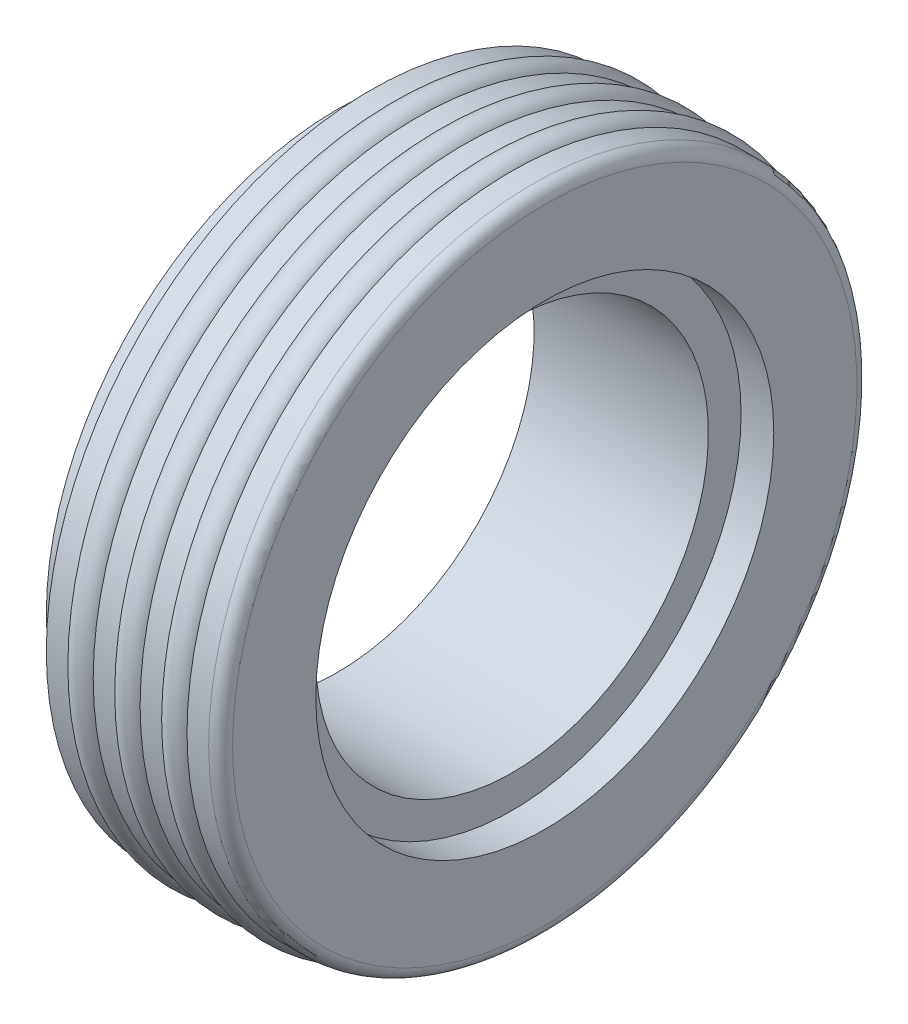
ISO-10303-21;
HEADER;
FILE_DESCRIPTION(('STEP AP214'),'2;1');
FILE_NAME('part.step','',(''),(''),'','','');
FILE_SCHEMA(('AUTOMOTIVE_DESIGN { 1 0 10303 214 1 1 1 1 }'));
ENDSEC;
DATA;
#1=APPLICATION_CONTEXT('core data for automotive mechanical design processes');
#2=APPLICATION_PROTOCOL_DEFINITION('international standard','automotive_design',2000,#1);
#3=PRODUCT_CONTEXT('',#1,'mechanical');
#4=PRODUCT('Part','Part','',(#3));
#5=PRODUCT_RELATED_PRODUCT_CATEGORY('part','',(#4));
#6=PRODUCT_DEFINITION_FORMATION('','',#4);
#7=PRODUCT_DEFINITION_CONTEXT('part definition',#1,'design');
#8=PRODUCT_DEFINITION('design','',#6,#7);
#9=PRODUCT_DEFINITION_SHAPE('','',#8);
#10=(LENGTH_UNIT() NAMED_UNIT(*) SI_UNIT(.MILLI.,.METRE.));
#11=(NAMED_UNIT(*) PLANE_ANGLE_UNIT() SI_UNIT($,.RADIAN.));
#12=(NAMED_UNIT(*) SI_UNIT($,.STERADIAN.) SOLID_ANGLE_UNIT());
#13=UNCERTAINTY_MEASURE_WITH_UNIT(LENGTH_MEASURE(1.E-05),#10,'distance_accuracy_value','');
#14=(GEOMETRIC_REPRESENTATION_CONTEXT(3) GLOBAL_UNCERTAINTY_ASSIGNED_CONTEXT((#13)) GLOBAL_UNIT_ASSIGNED_CONTEXT((#10,
#11,#12)) REPRESENTATION_CONTEXT('',''));
#15=CARTESIAN_POINT('',(0.,0.,0.));
#16=DIRECTION('',(0.,0.,1.));
#17=DIRECTION('',(1.,0.,0.));
#18=AXIS2_PLACEMENT_3D('',#15,#16,#17);
#19=CARTESIAN_POINT('',(7.75725,20.64,0.));
#20=DIRECTION('',(1.,0.,0.));
#21=DIRECTION('',(0.,0.,-1.));
#22=AXIS2_PLACEMENT_3D('',#19,#20,#21);
#23=PLANE('',#22);
#24=CARTESIAN_POINT('',(7.75725,0.,0.));
#25=DIRECTION('',(-1.,0.,0.));
#26=DIRECTION('',(0.,0.,1.));
#27=AXIS2_PLACEMENT_3D('',#24,#25,#26);
#28=CIRCLE('',#27,18.55875);
#29=CARTESIAN_POINT('',(7.75725,0.,18.55875));
#30=VERTEX_POINT('',#29);
#31=EDGE_CURVE('E12',#30,#30,#28,.T.);
#32=ORIENTED_EDGE('',*,*,#31,.F.);
#33=EDGE_LOOP('',(#32));
#34=FACE_BOUND('',#33,.T.);
#35=CARTESIAN_POINT('',(7.75725,0.,0.));
#36=DIRECTION('',(-1.,0.,0.));
#37=DIRECTION('',(0.,0.,1.));
#38=AXIS2_PLACEMENT_3D('',#35,#36,#37);
#39=CIRCLE('',#38,20.64);
#40=CARTESIAN_POINT('',(7.75725,0.,20.64));
#41=VERTEX_POINT('',#40);
#42=EDGE_CURVE('E98',#41,#41,#39,.T.);
#43=ORIENTED_EDGE('',*,*,#42,.T.);
#44=EDGE_LOOP('',(#43));
#45=FACE_BOUND('',#44,.T.);
#46=ADVANCED_FACE('F54',(#34,#45),#23,.F.);
#47=CARTESIAN_POINT('',(-16.776,0.,0.));
#48=DIRECTION('',(-1.,0.,0.));
#49=DIRECTION('',(0.,0.,1.));
#50=AXIS2_PLACEMENT_3D('',#47,#48,#49);
#51=CYLINDRICAL_SURFACE('',#50,18.55875);
#52=CARTESIAN_POINT('',(16.776,0.,0.));
#53=DIRECTION('',(-1.,0.,0.));
#54=DIRECTION('',(0.,0.,1.));
#55=AXIS2_PLACEMENT_3D('',#52,#53,#54);
#56=CIRCLE('',#55,18.55875);
#57=CARTESIAN_POINT('',(16.776,0.,18.55875));
#58=VERTEX_POINT('',#57);
#59=EDGE_CURVE('E61',#58,#58,#56,.T.);
#60=ORIENTED_EDGE('',*,*,#59,.F.);
#61=EDGE_LOOP('',(#60));
#62=FACE_BOUND('',#61,.T.);
#63=ORIENTED_EDGE('',*,*,#31,.T.);
#64=EDGE_LOOP('',(#63));
#65=FACE_BOUND('',#64,.T.);
#66=ADVANCED_FACE('F164',(#62,#65),#51,.F.);
#67=CARTESIAN_POINT('',(16.776,18.55875,0.));
#68=DIRECTION('',(1.,0.,0.));
#69=DIRECTION('',(0.,0.,-1.));
#70=AXIS2_PLACEMENT_3D('',#67,#68,#69);
#71=PLANE('',#70);
#72=CARTESIAN_POINT('',(16.776,0.,0.));
#73=DIRECTION('',(-1.,0.,0.));
#74=DIRECTION('',(0.,0.,1.));
#75=AXIS2_PLACEMENT_3D('',#72,#73,#74);
#76=CIRCLE('',#75,14.58125);
#77=CARTESIAN_POINT('',(16.776,0.,14.58125));
#78=VERTEX_POINT('',#77);
#79=EDGE_CURVE('E64',#78,#78,#76,.T.);
#80=ORIENTED_EDGE('',*,*,#79,.F.);
#81=EDGE_LOOP('',(#80));
#82=FACE_BOUND('',#81,.T.);
#83=ORIENTED_EDGE('',*,*,#59,.T.);
#84=EDGE_LOOP('',(#83));
#85=FACE_BOUND('',#84,.T.);
#86=ADVANCED_FACE('F158',(#82,#85),#71,.F.);
#87=CARTESIAN_POINT('',(-16.776,0.,0.));
#88=DIRECTION('',(-1.,0.,0.));
#89=DIRECTION('',(0.,0.,1.));
#90=AXIS2_PLACEMENT_3D('',#87,#88,#89);
#91=CYLINDRICAL_SURFACE('',#90,14.58125);
#92=CARTESIAN_POINT('',(18.85725,0.,0.));
#93=DIRECTION('',(-1.,0.,0.));
#94=DIRECTION('',(0.,0.,1.));
#95=AXIS2_PLACEMENT_3D('',#92,#93,#94);
#96=CIRCLE('',#95,14.58125);
#97=CARTESIAN_POINT('',(18.85725,0.,14.58125));
#98=VERTEX_POINT('',#97);
#99=EDGE_CURVE('E66',#98,#98,#96,.T.);
#100=ORIENTED_EDGE('',*,*,#99,.F.);
#101=EDGE_LOOP('',(#100));
#102=FACE_BOUND('',#101,.T.);
#103=ORIENTED_EDGE('',*,*,#79,.T.);
#104=EDGE_LOOP('',(#103));
#105=FACE_BOUND('',#104,.T.);
#106=ADVANCED_FACE('F153',(#102,#105),#91,.F.);
#107=CARTESIAN_POINT('',(18.85725,14.58125,0.));
#108=DIRECTION('',(-1.,0.,0.));
#109=DIRECTION('',(0.,0.,1.));
#110=AXIS2_PLACEMENT_3D('',#107,#108,#109);
#111=PLANE('',#110);
#112=CARTESIAN_POINT('',(18.85725,0.,0.));
#113=DIRECTION('',(-1.,0.,0.));
#114=DIRECTION('',(0.,0.,1.));
#115=AXIS2_PLACEMENT_3D('',#112,#113,#114);
#116=CIRCLE('',#115,19.878);
#117=CARTESIAN_POINT('',(18.85725,0.,19.878));
#118=VERTEX_POINT('',#117);
#119=EDGE_CURVE('E74',#118,#118,#116,.T.);
#120=ORIENTED_EDGE('',*,*,#119,.F.);
#121=EDGE_LOOP('',(#120));
#122=FACE_BOUND('',#121,.T.);
#123=ORIENTED_EDGE('',*,*,#99,.T.);
#124=EDGE_LOOP('',(#123));
#125=FACE_BOUND('',#124,.T.);
#126=ADVANCED_FACE('F148',(#122,#125),#111,.F.);
#127=CARTESIAN_POINT('',(18.09525,0.,0.));
#128=DIRECTION('',(-1.,0.,0.));
#129=DIRECTION('',(0.,0.,1.));
#130=AXIS2_PLACEMENT_3D('',#127,#128,#129);
#131=TOROIDAL_SURFACE('',#130,19.878,0.761999999999999);
#132=CARTESIAN_POINT('',(18.09525,0.,0.));
#133=DIRECTION('',(-1.,0.,0.));
#134=DIRECTION('',(0.,0.,1.));
#135=AXIS2_PLACEMENT_3D('',#132,#133,#134);
#136=CIRCLE('',#135,20.64);
#137=CARTESIAN_POINT('',(18.09525,0.,20.64));
#138=VERTEX_POINT('',#137);
#139=EDGE_CURVE('E76',#138,#138,#136,.T.);
#140=ORIENTED_EDGE('',*,*,#139,.F.);
#141=EDGE_LOOP('',(#140));
#142=FACE_BOUND('',#141,.T.);
#143=ORIENTED_EDGE('',*,*,#119,.T.);
#144=EDGE_LOOP('',(#143));
#145=FACE_BOUND('',#144,.T.);
#146=ADVANCED_FACE('F145',(#142,#145),#131,.T.);
#147=CARTESIAN_POINT('',(-16.776,0.,0.));
#148=DIRECTION('',(-1.,0.,0.));
#149=DIRECTION('',(0.,0.,1.));
#150=AXIS2_PLACEMENT_3D('',#147,#148,#149);
#151=CYLINDRICAL_SURFACE('',#150,20.64);
#152=CARTESIAN_POINT('',(16.7180359282291,0.,0.));
#153=DIRECTION('',(-1.,0.,0.));
#154=DIRECTION('',(0.,0.,1.));
#155=AXIS2_PLACEMENT_3D('',#152,#153,#154);
#156=CIRCLE('',#155,20.64);
#157=CARTESIAN_POINT('',(16.7180359282291,0.,20.64));
#158=VERTEX_POINT('',#157);
#159=EDGE_CURVE('E77',#158,#158,#156,.T.);
#160=ORIENTED_EDGE('',*,*,#159,.F.);
#161=EDGE_LOOP('',(#160));
#162=FACE_BOUND('',#161,.T.);
#163=ORIENTED_EDGE('',*,*,#139,.T.);
#164=EDGE_LOOP('',(#163));
#165=FACE_BOUND('',#164,.T.);
#166=ADVANCED_FACE('F136',(#162,#165),#151,.T.);
#167=CARTESIAN_POINT('',(15.913178642743,0.,0.));
#168=DIRECTION('',(-1.,0.,0.));
#169=DIRECTION('',(0.,0.,1.));
#170=AXIS2_PLACEMENT_3D('',#167,#168,#169);
#171=TOROIDAL_SURFACE('',#170,19.980375,1.040625);
#172=CARTESIAN_POINT('',(15.108321357257,0.,0.));
#173=DIRECTION('',(-1.,0.,0.));
#174=DIRECTION('',(0.,0.,1.));
#175=AXIS2_PLACEMENT_3D('',#172,#173,#174);
#176=CIRCLE('',#175,20.64);
#177=CARTESIAN_POINT('',(15.108321357257,0.,20.64));
#178=VERTEX_POINT('',#177);
#179=EDGE_CURVE('E81',#178,#178,#176,.T.);
#180=ORIENTED_EDGE('',*,*,#179,.F.);
#181=EDGE_LOOP('',(#180));
#182=FACE_BOUND('',#181,.T.);
#183=ORIENTED_EDGE('',*,*,#159,.T.);
#184=EDGE_LOOP('',(#183));
#185=FACE_BOUND('',#184,.T.);
#186=ADVANCED_FACE('F129',(#182,#185),#171,.T.);
#187=CARTESIAN_POINT('',(-16.776,0.,0.));
#188=DIRECTION('',(-1.,0.,0.));
#189=DIRECTION('',(0.,0.,1.));
#190=AXIS2_PLACEMENT_3D('',#187,#188,#189);
#191=CYLINDRICAL_SURFACE('',#190,20.64);
#192=CARTESIAN_POINT('',(13.7311072854861,0.,0.));
#193=DIRECTION('',(-1.,0.,0.));
#194=DIRECTION('',(0.,0.,1.));
#195=AXIS2_PLACEMENT_3D('',#192,#193,#194);
#196=CIRCLE('',#195,20.64);
#197=CARTESIAN_POINT('',(13.7311072854861,0.,20.64));
#198=VERTEX_POINT('',#197);
#199=EDGE_CURVE('E86',#198,#198,#196,.T.);
#200=ORIENTED_EDGE('',*,*,#199,.F.);
#201=EDGE_LOOP('',(#200));
#202=FACE_BOUND('',#201,.T.);
#203=ORIENTED_EDGE('',*,*,#179,.T.);
#204=EDGE_LOOP('',(#203));
#205=FACE_BOUND('',#204,.T.);
#206=ADVANCED_FACE('F122',(#202,#205),#191,.T.);
#207=CARTESIAN_POINT('',(12.92625,0.,0.));
#208=DIRECTION('',(-1.,0.,0.));
#209=DIRECTION('',(0.,0.,1.));
#210=AXIS2_PLACEMENT_3D('',#207,#208,#209);
#211=TOROIDAL_SURFACE('',#210,19.980375,1.040625);
#212=CARTESIAN_POINT('',(12.1213927145139,0.,0.));
#213=DIRECTION('',(-1.,0.,0.));
#214=DIRECTION('',(0.,0.,1.));
#215=AXIS2_PLACEMENT_3D('',#212,#213,#214);
#216=CIRCLE('',#215,20.64);
#217=CARTESIAN_POINT('',(12.1213927145139,0.,20.64));
#218=VERTEX_POINT('',#217);
#219=EDGE_CURVE('E88',#218,#218,#216,.T.);
#220=ORIENTED_EDGE('',*,*,#219,.F.);
#221=EDGE_LOOP('',(#220));
#222=FACE_BOUND('',#221,.T.);
#223=ORIENTED_EDGE('',*,*,#199,.T.);
#224=EDGE_LOOP('',(#223));
#225=FACE_BOUND('',#224,.T.);
#226=ADVANCED_FACE('F118',(#222,#225),#211,.T.);
#227=CARTESIAN_POINT('',(-16.776,0.,0.));
#228=DIRECTION('',(-1.,0.,0.));
#229=DIRECTION('',(0.,0.,1.));
#230=AXIS2_PLACEMENT_3D('',#227,#228,#229);
#231=CYLINDRICAL_SURFACE('',#230,20.64);
#232=CARTESIAN_POINT('',(10.744178642743,0.,0.));
#233=DIRECTION('',(-1.,0.,0.));
#234=DIRECTION('',(0.,0.,1.));
#235=AXIS2_PLACEMENT_3D('',#232,#233,#234);
#236=CIRCLE('',#235,20.64);
#237=CARTESIAN_POINT('',(10.744178642743,0.,20.64));
#238=VERTEX_POINT('',#237);
#239=EDGE_CURVE('E95',#238,#238,#236,.T.);
#240=ORIENTED_EDGE('',*,*,#239,.F.);
#241=EDGE_LOOP('',(#240));
#242=FACE_BOUND('',#241,.T.);
#243=ORIENTED_EDGE('',*,*,#219,.T.);
#244=EDGE_LOOP('',(#243));
#245=FACE_BOUND('',#244,.T.);
#246=ADVANCED_FACE('F115',(#242,#245),#231,.T.);
#247=CARTESIAN_POINT('',(9.93932135725697,0.,0.));
#248=DIRECTION('',(-1.,0.,0.));
#249=DIRECTION('',(0.,0.,1.));
#250=AXIS2_PLACEMENT_3D('',#247,#248,#249);
#251=TOROIDAL_SURFACE('',#250,19.980375,1.040625);
#252=CARTESIAN_POINT('',(9.1344640717709,0.,0.));
#253=DIRECTION('',(-1.,0.,0.));
#254=DIRECTION('',(0.,0.,1.));
#255=AXIS2_PLACEMENT_3D('',#252,#253,#254);
#256=CIRCLE('',#255,20.64);
#257=CARTESIAN_POINT('',(9.1344640717709,0.,20.64));
#258=VERTEX_POINT('',#257);
#259=EDGE_CURVE('E93',#258,#258,#256,.T.);
#260=ORIENTED_EDGE('',*,*,#259,.F.);
#261=EDGE_LOOP('',(#260));
#262=FACE_BOUND('',#261,.T.);
#263=ORIENTED_EDGE('',*,*,#239,.T.);
#264=EDGE_LOOP('',(#263));
#265=FACE_BOUND('',#264,.T.);
#266=ADVANCED_FACE('F108',(#262,#265),#251,.T.);
#267=CARTESIAN_POINT('',(-16.776,0.,0.));
#268=DIRECTION('',(-1.,0.,0.));
#269=DIRECTION('',(0.,0.,1.));
#270=AXIS2_PLACEMENT_3D('',#267,#268,#269);
#271=CYLINDRICAL_SURFACE('',#270,20.64);
#272=ORIENTED_EDGE('',*,*,#42,.F.);
#273=EDGE_LOOP('',(#272));
#274=FACE_BOUND('',#273,.T.);
#275=ORIENTED_EDGE('',*,*,#259,.T.);
#276=EDGE_LOOP('',(#275));
#277=FACE_BOUND('',#276,.T.);
#278=ADVANCED_FACE('F105',(#274,#277),#271,.T.);
#279=CLOSED_SHELL('',(#46,#66,#86,#106,#126,#146,#166,#186,#206,#226,#246,#266,#278));
#280=MANIFOLD_SOLID_BREP('B2',#279);
#281=CARTESIAN_POINT('',(5.676,18.55875,0.));
#282=DIRECTION('',(1.,0.,0.));
#283=DIRECTION('',(0.,0.,-1.));
#284=AXIS2_PLACEMENT_3D('',#281,#282,#283);
#285=PLANE('',#284);
#286=CARTESIAN_POINT('',(5.676,0.,0.));
#287=DIRECTION('',(-1.,0.,0.));
#288=DIRECTION('',(0.,0.,1.));
#289=AXIS2_PLACEMENT_3D('',#286,#287,#288);
#290=CIRCLE('',#289,12.5);
#291=CARTESIAN_POINT('',(5.676,0.,12.5));
#292=VERTEX_POINT('',#291);
#293=EDGE_CURVE('E53',#292,#292,#290,.T.);
#294=ORIENTED_EDGE('',*,*,#293,.F.);
#295=EDGE_LOOP('',(#294));
#296=FACE_BOUND('',#295,.T.);
#297=CARTESIAN_POINT('',(5.676,0.,0.));
#298=DIRECTION('',(-1.,0.,0.));
#299=DIRECTION('',(0.,0.,1.));
#300=AXIS2_PLACEMENT_3D('',#297,#298,#299);
#301=CIRCLE('',#300,18.55875);
#302=CARTESIAN_POINT('',(5.676,0.,18.55875));
#303=VERTEX_POINT('',#302);
#304=EDGE_CURVE('E330',#303,#303,#301,.T.);
#305=ORIENTED_EDGE('',*,*,#304,.T.);
#306=EDGE_LOOP('',(#305));
#307=FACE_BOUND('',#306,.T.);
#308=ADVANCED_FACE('F313',(#296,#307),#285,.F.);
#309=CARTESIAN_POINT('',(-16.776,0.,0.));
#310=DIRECTION('',(-1.,0.,0.));
#311=DIRECTION('',(0.,0.,1.));
#312=AXIS2_PLACEMENT_3D('',#309,#310,#311);
#313=CYLINDRICAL_SURFACE('',#312,12.5);
#314=CARTESIAN_POINT('',(16.776,0.,0.));
#315=DIRECTION('',(-1.,0.,0.));
#316=DIRECTION('',(0.,0.,1.));
#317=AXIS2_PLACEMENT_3D('',#314,#315,#316);
#318=CIRCLE('',#317,12.5);
#319=CARTESIAN_POINT('',(16.776,0.,12.5));
#320=VERTEX_POINT('',#319);
#321=EDGE_CURVE('E318',#320,#320,#318,.T.);
#322=ORIENTED_EDGE('',*,*,#321,.F.);
#323=EDGE_LOOP('',(#322));
#324=FACE_BOUND('',#323,.T.);
#325=ORIENTED_EDGE('',*,*,#293,.T.);
#326=EDGE_LOOP('',(#325));
#327=FACE_BOUND('',#326,.T.);
#328=ADVANCED_FACE('F343',(#324,#327),#313,.F.);
#329=CARTESIAN_POINT('',(16.776,18.55875,0.));
#330=DIRECTION('',(-1.,0.,0.));
#331=DIRECTION('',(0.,0.,1.));
#332=AXIS2_PLACEMENT_3D('',#329,#330,#331);
#333=PLANE('',#332);
#334=CARTESIAN_POINT('',(16.776,0.,0.));
#335=DIRECTION('',(-1.,0.,0.));
#336=DIRECTION('',(0.,0.,1.));
#337=AXIS2_PLACEMENT_3D('',#334,#335,#336);
#338=CIRCLE('',#337,18.55875);
#339=CARTESIAN_POINT('',(16.776,0.,18.55875));
#340=VERTEX_POINT('',#339);
#341=EDGE_CURVE('E324',#340,#340,#338,.T.);
#342=ORIENTED_EDGE('',*,*,#341,.F.);
#343=EDGE_LOOP('',(#342));
#344=FACE_BOUND('',#343,.T.);
#345=ORIENTED_EDGE('',*,*,#321,.T.);
#346=EDGE_LOOP('',(#345));
#347=FACE_BOUND('',#346,.T.);
#348=ADVANCED_FACE('F336',(#344,#347),#333,.F.);
#349=CARTESIAN_POINT('',(-16.776,0.,0.));
#350=DIRECTION('',(-1.,0.,0.));
#351=DIRECTION('',(0.,0.,1.));
#352=AXIS2_PLACEMENT_3D('',#349,#350,#351);
#353=CYLINDRICAL_SURFACE('',#352,18.55875);
#354=ORIENTED_EDGE('',*,*,#304,.F.);
#355=EDGE_LOOP('',(#354));
#356=FACE_BOUND('',#355,.T.);
#357=ORIENTED_EDGE('',*,*,#341,.T.);
#358=EDGE_LOOP('',(#357));
#359=FACE_BOUND('',#358,.T.);
#360=ADVANCED_FACE('F334',(#356,#359),#353,.T.);
#361=CLOSED_SHELL('',(#308,#328,#348,#360));
#362=MANIFOLD_SOLID_BREP('B7',#361);
#363=ADVANCED_BREP_SHAPE_REPRESENTATION('',(#18,#280,#362),#14);
#364=SHAPE_DEFINITION_REPRESENTATION(#9,#363);
ENDSEC;
END-ISO-10303-21;
